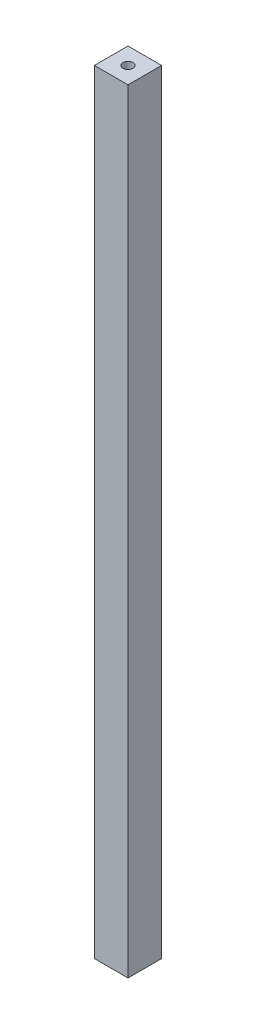
ISO-10303-21;
HEADER;
FILE_DESCRIPTION(('STEP AP214'),'2;1');
FILE_NAME('part.step','',(''),(''),'','','');
FILE_SCHEMA(('AUTOMOTIVE_DESIGN { 1 0 10303 214 1 1 1 1 }'));
ENDSEC;
DATA;
#1=APPLICATION_CONTEXT('core data for automotive mechanical design processes');
#2=APPLICATION_PROTOCOL_DEFINITION('international standard','automotive_design',2000,#1);
#3=PRODUCT_CONTEXT('',#1,'mechanical');
#4=PRODUCT('Part','Part','',(#3));
#5=PRODUCT_RELATED_PRODUCT_CATEGORY('part','',(#4));
#6=PRODUCT_DEFINITION_FORMATION('','',#4);
#7=PRODUCT_DEFINITION_CONTEXT('part definition',#1,'design');
#8=PRODUCT_DEFINITION('design','',#6,#7);
#9=PRODUCT_DEFINITION_SHAPE('','',#8);
#10=(LENGTH_UNIT() NAMED_UNIT(*) SI_UNIT(.MILLI.,.METRE.));
#11=(NAMED_UNIT(*) PLANE_ANGLE_UNIT() SI_UNIT($,.RADIAN.));
#12=(NAMED_UNIT(*) SI_UNIT($,.STERADIAN.) SOLID_ANGLE_UNIT());
#13=UNCERTAINTY_MEASURE_WITH_UNIT(LENGTH_MEASURE(1.E-05),#10,'distance_accuracy_value','');
#14=(GEOMETRIC_REPRESENTATION_CONTEXT(3) GLOBAL_UNCERTAINTY_ASSIGNED_CONTEXT((#13)) GLOBAL_UNIT_ASSIGNED_CONTEXT((#10,
#11,#12)) REPRESENTATION_CONTEXT('',''));
#15=CARTESIAN_POINT('',(0.,0.,0.));
#16=DIRECTION('',(0.,0.,1.));
#17=DIRECTION('',(1.,0.,0.));
#18=AXIS2_PLACEMENT_3D('',#15,#16,#17);
#19=CARTESIAN_POINT('',(0.,460.,20.));
#20=DIRECTION('',(1.,0.,0.));
#21=DIRECTION('',(0.,0.,-1.));
#22=AXIS2_PLACEMENT_3D('',#19,#20,#21);
#23=PLANE('',#22);
#24=DIRECTION('',(0.,-1.,0.));
#25=VECTOR('',#24,1.);
#26=CARTESIAN_POINT('',(0.,460.,0.));
#27=LINE('',#26,#25);
#28=CARTESIAN_POINT('',(0.,460.,0.));
#29=VERTEX_POINT('',#28);
#30=CARTESIAN_POINT('',(0.,0.,0.));
#31=VERTEX_POINT('',#30);
#32=EDGE_CURVE('E111',#29,#31,#27,.T.);
#33=ORIENTED_EDGE('',*,*,#32,.T.);
#34=DIRECTION('',(0.,0.,-1.));
#35=VECTOR('',#34,1.);
#36=CARTESIAN_POINT('',(0.,0.,20.));
#37=LINE('',#36,#35);
#38=CARTESIAN_POINT('',(0.,0.,20.));
#39=VERTEX_POINT('',#38);
#40=EDGE_CURVE('E11',#39,#31,#37,.T.);
#41=ORIENTED_EDGE('',*,*,#40,.F.);
#42=DIRECTION('',(0.,-1.,0.));
#43=VECTOR('',#42,1.);
#44=CARTESIAN_POINT('',(0.,460.,20.));
#45=LINE('',#44,#43);
#46=CARTESIAN_POINT('',(0.,460.,20.));
#47=VERTEX_POINT('',#46);
#48=EDGE_CURVE('E113',#47,#39,#45,.T.);
#49=ORIENTED_EDGE('',*,*,#48,.F.);
#50=DIRECTION('',(0.,0.,-1.));
#51=VECTOR('',#50,1.);
#52=CARTESIAN_POINT('',(0.,460.,20.));
#53=LINE('',#52,#51);
#54=EDGE_CURVE('E119',#47,#29,#53,.T.);
#55=ORIENTED_EDGE('',*,*,#54,.T.);
#56=EDGE_LOOP('',(#33,#41,#49,#55));
#57=FACE_BOUND('',#56,.T.);
#58=ADVANCED_FACE('F40',(#57),#23,.F.);
#59=CARTESIAN_POINT('',(0.,0.,20.));
#60=DIRECTION('',(0.,1.,0.));
#61=DIRECTION('',(0.,0.,1.));
#62=AXIS2_PLACEMENT_3D('',#59,#60,#61);
#63=PLANE('',#62);
#64=CARTESIAN_POINT('',(10.,0.,10.));
#65=DIRECTION('',(0.,-1.,0.));
#66=DIRECTION('',(0.,0.,-1.));
#67=AXIS2_PLACEMENT_3D('',#64,#65,#66);
#68=CIRCLE('',#67,3.4);
#69=CARTESIAN_POINT('',(10.,0.,6.6));
#70=VERTEX_POINT('',#69);
#71=EDGE_CURVE('E102',#70,#70,#68,.T.);
#72=ORIENTED_EDGE('',*,*,#71,.F.);
#73=EDGE_LOOP('',(#72));
#74=FACE_BOUND('',#73,.T.);
#75=DIRECTION('',(1.,0.,0.));
#76=VECTOR('',#75,1.);
#77=CARTESIAN_POINT('',(0.,0.,0.));
#78=LINE('',#77,#76);
#79=CARTESIAN_POINT('',(20.,0.,0.));
#80=VERTEX_POINT('',#79);
#81=EDGE_CURVE('E122',#31,#80,#78,.T.);
#82=ORIENTED_EDGE('',*,*,#81,.T.);
#83=DIRECTION('',(0.,0.,-1.));
#84=VECTOR('',#83,1.);
#85=CARTESIAN_POINT('',(20.,0.,20.));
#86=LINE('',#85,#84);
#87=CARTESIAN_POINT('',(20.,0.,20.));
#88=VERTEX_POINT('',#87);
#89=EDGE_CURVE('E48',#88,#80,#86,.T.);
#90=ORIENTED_EDGE('',*,*,#89,.F.);
#91=DIRECTION('',(1.,0.,0.));
#92=VECTOR('',#91,1.);
#93=CARTESIAN_POINT('',(0.,0.,20.));
#94=LINE('',#93,#92);
#95=EDGE_CURVE('E87',#39,#88,#94,.T.);
#96=ORIENTED_EDGE('',*,*,#95,.F.);
#97=ORIENTED_EDGE('',*,*,#40,.T.);
#98=EDGE_LOOP('',(#82,#90,#96,#97));
#99=FACE_BOUND('',#98,.T.);
#100=ADVANCED_FACE('F146',(#74,#99),#63,.F.);
#101=CARTESIAN_POINT('',(20.,0.,20.));
#102=DIRECTION('',(-1.,0.,0.));
#103=DIRECTION('',(0.,0.,1.));
#104=AXIS2_PLACEMENT_3D('',#101,#102,#103);
#105=PLANE('',#104);
#106=DIRECTION('',(0.,1.,0.));
#107=VECTOR('',#106,1.);
#108=CARTESIAN_POINT('',(20.,0.,0.));
#109=LINE('',#108,#107);
#110=CARTESIAN_POINT('',(20.,460.,0.));
#111=VERTEX_POINT('',#110);
#112=EDGE_CURVE('E74',#80,#111,#109,.T.);
#113=ORIENTED_EDGE('',*,*,#112,.T.);
#114=DIRECTION('',(0.,0.,-1.));
#115=VECTOR('',#114,1.);
#116=CARTESIAN_POINT('',(20.,460.,20.));
#117=LINE('',#116,#115);
#118=CARTESIAN_POINT('',(20.,460.,20.));
#119=VERTEX_POINT('',#118);
#120=EDGE_CURVE('E127',#119,#111,#117,.T.);
#121=ORIENTED_EDGE('',*,*,#120,.F.);
#122=DIRECTION('',(0.,1.,0.));
#123=VECTOR('',#122,1.);
#124=CARTESIAN_POINT('',(20.,0.,20.));
#125=LINE('',#124,#123);
#126=EDGE_CURVE('E116',#88,#119,#125,.T.);
#127=ORIENTED_EDGE('',*,*,#126,.F.);
#128=ORIENTED_EDGE('',*,*,#89,.T.);
#129=EDGE_LOOP('',(#113,#121,#127,#128));
#130=FACE_BOUND('',#129,.T.);
#131=ADVANCED_FACE('F129',(#130),#105,.F.);
#132=CARTESIAN_POINT('',(20.,460.,20.));
#133=DIRECTION('',(0.,-1.,0.));
#134=DIRECTION('',(0.,0.,-1.));
#135=AXIS2_PLACEMENT_3D('',#132,#133,#134);
#136=PLANE('',#135);
#137=CARTESIAN_POINT('',(10.,460.,10.));
#138=DIRECTION('',(0.,1.,0.));
#139=DIRECTION('',(0.,0.,1.));
#140=AXIS2_PLACEMENT_3D('',#137,#138,#139);
#141=CIRCLE('',#140,3.);
#142=CARTESIAN_POINT('',(10.,460.,13.));
#143=VERTEX_POINT('',#142);
#144=EDGE_CURVE('E101',#143,#143,#141,.T.);
#145=ORIENTED_EDGE('',*,*,#144,.F.);
#146=EDGE_LOOP('',(#145));
#147=FACE_BOUND('',#146,.T.);
#148=DIRECTION('',(-1.,0.,0.));
#149=VECTOR('',#148,1.);
#150=CARTESIAN_POINT('',(20.,460.,0.));
#151=LINE('',#150,#149);
#152=EDGE_CURVE('E80',#111,#29,#151,.T.);
#153=ORIENTED_EDGE('',*,*,#152,.T.);
#154=ORIENTED_EDGE('',*,*,#54,.F.);
#155=DIRECTION('',(-1.,0.,0.));
#156=VECTOR('',#155,1.);
#157=CARTESIAN_POINT('',(20.,460.,20.));
#158=LINE('',#157,#156);
#159=EDGE_CURVE('E56',#119,#47,#158,.T.);
#160=ORIENTED_EDGE('',*,*,#159,.F.);
#161=ORIENTED_EDGE('',*,*,#120,.T.);
#162=EDGE_LOOP('',(#153,#154,#160,#161));
#163=FACE_BOUND('',#162,.T.);
#164=ADVANCED_FACE('F136',(#147,#163),#136,.F.);
#165=CARTESIAN_POINT('',(0.,0.,20.));
#166=DIRECTION('',(0.,0.,1.));
#167=DIRECTION('',(1.,0.,0.));
#168=AXIS2_PLACEMENT_3D('',#165,#166,#167);
#169=PLANE('',#168);
#170=ORIENTED_EDGE('',*,*,#48,.T.);
#171=ORIENTED_EDGE('',*,*,#95,.T.);
#172=ORIENTED_EDGE('',*,*,#126,.T.);
#173=ORIENTED_EDGE('',*,*,#159,.T.);
#174=EDGE_LOOP('',(#170,#171,#172,#173));
#175=FACE_BOUND('',#174,.T.);
#176=ADVANCED_FACE('F138',(#175),#169,.T.);
#177=CARTESIAN_POINT('',(0.,0.,0.));
#178=DIRECTION('',(0.,0.,1.));
#179=DIRECTION('',(1.,0.,0.));
#180=AXIS2_PLACEMENT_3D('',#177,#178,#179);
#181=PLANE('',#180);
#182=ORIENTED_EDGE('',*,*,#32,.F.);
#183=ORIENTED_EDGE('',*,*,#152,.F.);
#184=ORIENTED_EDGE('',*,*,#112,.F.);
#185=ORIENTED_EDGE('',*,*,#81,.F.);
#186=EDGE_LOOP('',(#182,#183,#184,#185));
#187=FACE_BOUND('',#186,.T.);
#188=ADVANCED_FACE('F132',(#187),#181,.F.);
#189=CARTESIAN_POINT('',(10.,60.,10.));
#190=DIRECTION('',(0.,1.,0.));
#191=DIRECTION('',(0.,0.,1.));
#192=AXIS2_PLACEMENT_3D('',#189,#190,#191);
#193=CYLINDRICAL_SURFACE('',#192,3.);
#194=CARTESIAN_POINT('',(10.,60.,10.));
#195=DIRECTION('',(0.,1.,0.));
#196=DIRECTION('',(0.,0.,1.));
#197=AXIS2_PLACEMENT_3D('',#194,#195,#196);
#198=CIRCLE('',#197,3.);
#199=CARTESIAN_POINT('',(10.,60.,13.));
#200=VERTEX_POINT('',#199);
#201=EDGE_CURVE('E105',#200,#200,#198,.T.);
#202=ORIENTED_EDGE('',*,*,#201,.F.);
#203=EDGE_LOOP('',(#202));
#204=FACE_BOUND('',#203,.T.);
#205=ORIENTED_EDGE('',*,*,#144,.T.);
#206=EDGE_LOOP('',(#205));
#207=FACE_BOUND('',#206,.T.);
#208=ADVANCED_FACE('F166',(#204,#207),#193,.F.);
#209=CARTESIAN_POINT('',(0.,60.,0.));
#210=DIRECTION('',(0.,1.,0.));
#211=DIRECTION('',(0.,0.,1.));
#212=AXIS2_PLACEMENT_3D('',#209,#210,#211);
#213=PLANE('',#212);
#214=ORIENTED_EDGE('',*,*,#201,.T.);
#215=EDGE_LOOP('',(#214));
#216=FACE_BOUND('',#215,.T.);
#217=ADVANCED_FACE('F95',(#216),#213,.T.);
#218=CARTESIAN_POINT('',(10.,19.75,10.));
#219=DIRECTION('',(0.,-1.,0.));
#220=DIRECTION('',(0.,0.,-1.));
#221=AXIS2_PLACEMENT_3D('',#218,#219,#220);
#222=CONICAL_SURFACE('',#221,3.4,1.02974425867665);
#223=CARTESIAN_POINT('',(9.99999999999999,21.7929261046937,10.));
#224=VERTEX_POINT('',#223);
#225=VERTEX_LOOP('',#224);
#226=FACE_BOUND('',#225,.T.);
#227=CARTESIAN_POINT('',(10.,19.75,10.));
#228=DIRECTION('',(0.,-1.,0.));
#229=DIRECTION('',(0.,0.,-1.));
#230=AXIS2_PLACEMENT_3D('',#227,#228,#229);
#231=CIRCLE('',#230,3.4);
#232=CARTESIAN_POINT('',(10.,19.75,6.6));
#233=VERTEX_POINT('',#232);
#234=EDGE_CURVE('E99',#233,#233,#231,.T.);
#235=ORIENTED_EDGE('',*,*,#234,.T.);
#236=EDGE_LOOP('',(#235));
#237=FACE_BOUND('',#236,.T.);
#238=ADVANCED_FACE('F91',(#226,#237),#222,.F.);
#239=CARTESIAN_POINT('',(10.,0.,10.));
#240=DIRECTION('',(0.,-1.,0.));
#241=DIRECTION('',(0.,0.,-1.));
#242=AXIS2_PLACEMENT_3D('',#239,#240,#241);
#243=CYLINDRICAL_SURFACE('',#242,3.4);
#244=ORIENTED_EDGE('',*,*,#234,.F.);
#245=EDGE_LOOP('',(#244));
#246=FACE_BOUND('',#245,.T.);
#247=ORIENTED_EDGE('',*,*,#71,.T.);
#248=EDGE_LOOP('',(#247));
#249=FACE_BOUND('',#248,.T.);
#250=ADVANCED_FACE('F94',(#246,#249),#243,.F.);
#251=CLOSED_SHELL('',(#58,#100,#131,#164,#176,#188,#208,#217,#238,#250));
#252=MANIFOLD_SOLID_BREP('B2',#251);
#253=ADVANCED_BREP_SHAPE_REPRESENTATION('',(#18,#252),#14);
#254=SHAPE_DEFINITION_REPRESENTATION(#9,#253);
ENDSEC;
END-ISO-10303-21;
